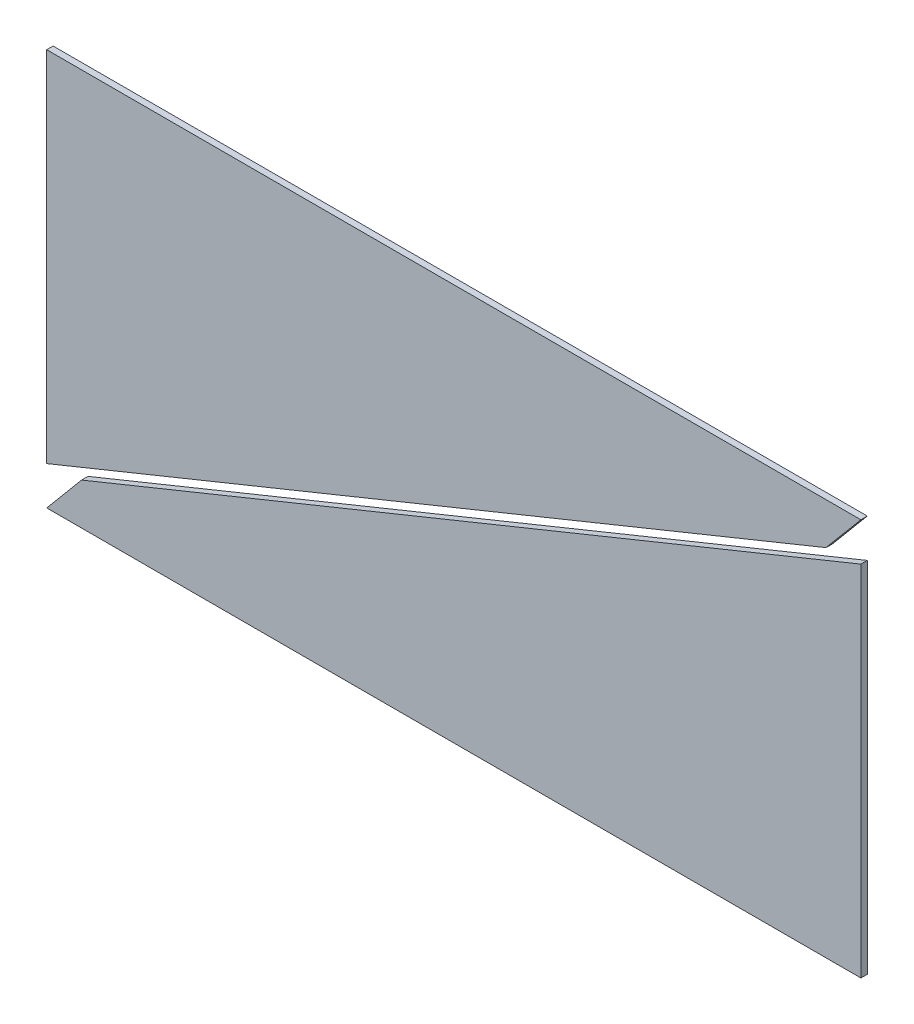
ISO-10303-21;
HEADER;
FILE_DESCRIPTION(('STEP AP214'),'2;1');
FILE_NAME('part.step','',(''),(''),'','','');
FILE_SCHEMA(('AUTOMOTIVE_DESIGN { 1 0 10303 214 1 1 1 1 }'));
ENDSEC;
DATA;
#1=APPLICATION_CONTEXT('core data for automotive mechanical design processes');
#2=APPLICATION_PROTOCOL_DEFINITION('international standard','automotive_design',2000,#1);
#3=PRODUCT_CONTEXT('',#1,'mechanical');
#4=PRODUCT('Part','Part','',(#3));
#5=PRODUCT_RELATED_PRODUCT_CATEGORY('part','',(#4));
#6=PRODUCT_DEFINITION_FORMATION('','',#4);
#7=PRODUCT_DEFINITION_CONTEXT('part definition',#1,'design');
#8=PRODUCT_DEFINITION('design','',#6,#7);
#9=PRODUCT_DEFINITION_SHAPE('','',#8);
#10=(LENGTH_UNIT() NAMED_UNIT(*) SI_UNIT(.MILLI.,.METRE.));
#11=(NAMED_UNIT(*) PLANE_ANGLE_UNIT() SI_UNIT($,.RADIAN.));
#12=(NAMED_UNIT(*) SI_UNIT($,.STERADIAN.) SOLID_ANGLE_UNIT());
#13=UNCERTAINTY_MEASURE_WITH_UNIT(LENGTH_MEASURE(1.E-05),#10,'distance_accuracy_value','');
#14=(GEOMETRIC_REPRESENTATION_CONTEXT(3) GLOBAL_UNCERTAINTY_ASSIGNED_CONTEXT((#13)) GLOBAL_UNIT_ASSIGNED_CONTEXT((#10,
#11,#12)) REPRESENTATION_CONTEXT('',''));
#15=CARTESIAN_POINT('',(0.,0.,0.));
#16=DIRECTION('',(0.,0.,1.));
#17=DIRECTION('',(1.,0.,0.));
#18=AXIS2_PLACEMENT_3D('',#15,#16,#17);
#19=CARTESIAN_POINT('',(14.5364415669839,6.12497433874092,0.25));
#20=DIRECTION('',(-0.376642714431054,0.926358605328416,0.));
#21=DIRECTION('',(-0.926358605328416,-0.376642714431054,0.));
#22=AXIS2_PLACEMENT_3D('',#19,#20,#21);
#23=PLANE('',#22);
#24=DIRECTION('',(0.926358605328416,0.376642714431054,0.));
#25=VECTOR('',#24,1.);
#26=CARTESIAN_POINT('',(14.5364415669839,6.12497433874092,0.));
#27=LINE('',#26,#25);
#28=CARTESIAN_POINT('',(-15.9,-6.25,0.));
#29=VERTEX_POINT('',#28);
#30=CARTESIAN_POINT('',(14.5364415669839,6.12497433874092,0.));
#31=VERTEX_POINT('',#30);
#32=EDGE_CURVE('E112',#29,#31,#27,.T.);
#33=ORIENTED_EDGE('',*,*,#32,.T.);
#34=DIRECTION('',(0.,0.,-1.));
#35=VECTOR('',#34,1.);
#36=CARTESIAN_POINT('',(14.5364415669839,6.12497433874092,0.25));
#37=LINE('',#36,#35);
#38=CARTESIAN_POINT('',(14.5364415669839,6.12497433874092,0.25));
#39=VERTEX_POINT('',#38);
#40=EDGE_CURVE('E12',#39,#31,#37,.T.);
#41=ORIENTED_EDGE('',*,*,#40,.F.);
#42=DIRECTION('',(0.926358605328416,0.376642714431054,0.));
#43=VECTOR('',#42,1.);
#44=CARTESIAN_POINT('',(14.5364415669839,6.12497433874092,0.25));
#45=LINE('',#44,#43);
#46=CARTESIAN_POINT('',(-15.9,-6.25,0.25));
#47=VERTEX_POINT('',#46);
#48=EDGE_CURVE('E100',#47,#39,#45,.T.);
#49=ORIENTED_EDGE('',*,*,#48,.F.);
#50=DIRECTION('',(0.,0.,-1.));
#51=VECTOR('',#50,1.);
#52=CARTESIAN_POINT('',(-15.9,-6.25,0.25));
#53=LINE('',#52,#51);
#54=EDGE_CURVE('E108',#47,#29,#53,.T.);
#55=ORIENTED_EDGE('',*,*,#54,.T.);
#56=EDGE_LOOP('',(#33,#41,#49,#55));
#57=FACE_BOUND('',#56,.T.);
#58=ADVANCED_FACE('F49',(#57),#23,.F.);
#59=CARTESIAN_POINT('',(15.9,7.75,0.25));
#60=DIRECTION('',(-0.766044443118974,0.642787609686544,0.));
#61=DIRECTION('',(-0.642787609686544,-0.766044443118974,0.));
#62=AXIS2_PLACEMENT_3D('',#59,#60,#61);
#63=PLANE('',#62);
#64=DIRECTION('',(0.642787609686544,0.766044443118974,0.));
#65=VECTOR('',#64,1.);
#66=CARTESIAN_POINT('',(15.9,7.75,0.));
#67=LINE('',#66,#65);
#68=CARTESIAN_POINT('',(15.9,7.75,0.));
#69=VERTEX_POINT('',#68);
#70=EDGE_CURVE('E104',#31,#69,#67,.T.);
#71=ORIENTED_EDGE('',*,*,#70,.T.);
#72=DIRECTION('',(0.,0.,-1.));
#73=VECTOR('',#72,1.);
#74=CARTESIAN_POINT('',(15.9,7.75,0.25));
#75=LINE('',#74,#73);
#76=CARTESIAN_POINT('',(15.9,7.75,0.25));
#77=VERTEX_POINT('',#76);
#78=EDGE_CURVE('E57',#77,#69,#75,.T.);
#79=ORIENTED_EDGE('',*,*,#78,.F.);
#80=DIRECTION('',(0.642787609686544,0.766044443118974,0.));
#81=VECTOR('',#80,1.);
#82=CARTESIAN_POINT('',(15.9,7.75,0.25));
#83=LINE('',#82,#81);
#84=EDGE_CURVE('E95',#39,#77,#83,.T.);
#85=ORIENTED_EDGE('',*,*,#84,.F.);
#86=ORIENTED_EDGE('',*,*,#40,.T.);
#87=EDGE_LOOP('',(#71,#79,#85,#86));
#88=FACE_BOUND('',#87,.T.);
#89=ADVANCED_FACE('F103',(#88),#63,.F.);
#90=CARTESIAN_POINT('',(-15.9,7.75,0.25));
#91=DIRECTION('',(0.,-1.,0.));
#92=DIRECTION('',(0.,0.,-1.));
#93=AXIS2_PLACEMENT_3D('',#90,#91,#92);
#94=PLANE('',#93);
#95=DIRECTION('',(-1.,0.,0.));
#96=VECTOR('',#95,1.);
#97=CARTESIAN_POINT('',(-15.9,7.75,0.));
#98=LINE('',#97,#96);
#99=CARTESIAN_POINT('',(-15.9,7.75,0.));
#100=VERTEX_POINT('',#99);
#101=EDGE_CURVE('E82',#69,#100,#98,.T.);
#102=ORIENTED_EDGE('',*,*,#101,.T.);
#103=DIRECTION('',(0.,0.,-1.));
#104=VECTOR('',#103,1.);
#105=CARTESIAN_POINT('',(-15.9,7.75,0.25));
#106=LINE('',#105,#104);
#107=CARTESIAN_POINT('',(-15.9,7.75,0.25));
#108=VERTEX_POINT('',#107);
#109=EDGE_CURVE('E105',#108,#100,#106,.T.);
#110=ORIENTED_EDGE('',*,*,#109,.F.);
#111=DIRECTION('',(-1.,0.,0.));
#112=VECTOR('',#111,1.);
#113=CARTESIAN_POINT('',(-15.9,7.75,0.25));
#114=LINE('',#113,#112);
#115=EDGE_CURVE('E98',#77,#108,#114,.T.);
#116=ORIENTED_EDGE('',*,*,#115,.F.);
#117=ORIENTED_EDGE('',*,*,#78,.T.);
#118=EDGE_LOOP('',(#102,#110,#116,#117));
#119=FACE_BOUND('',#118,.T.);
#120=ADVANCED_FACE('F106',(#119),#94,.F.);
#121=CARTESIAN_POINT('',(-15.9,-6.25,0.25));
#122=DIRECTION('',(1.,0.,0.));
#123=DIRECTION('',(0.,0.,-1.));
#124=AXIS2_PLACEMENT_3D('',#121,#122,#123);
#125=PLANE('',#124);
#126=DIRECTION('',(0.,-1.,0.));
#127=VECTOR('',#126,1.);
#128=CARTESIAN_POINT('',(-15.9,-6.25,0.));
#129=LINE('',#128,#127);
#130=EDGE_CURVE('E88',#100,#29,#129,.T.);
#131=ORIENTED_EDGE('',*,*,#130,.T.);
#132=ORIENTED_EDGE('',*,*,#54,.F.);
#133=DIRECTION('',(0.,-1.,0.));
#134=VECTOR('',#133,1.);
#135=CARTESIAN_POINT('',(-15.9,-6.25,0.25));
#136=LINE('',#135,#134);
#137=EDGE_CURVE('E65',#108,#47,#136,.T.);
#138=ORIENTED_EDGE('',*,*,#137,.F.);
#139=ORIENTED_EDGE('',*,*,#109,.T.);
#140=EDGE_LOOP('',(#131,#132,#138,#139));
#141=FACE_BOUND('',#140,.T.);
#142=ADVANCED_FACE('F119',(#141),#125,.F.);
#143=CARTESIAN_POINT('',(0.,0.,0.25));
#144=DIRECTION('',(0.,0.,-1.));
#145=DIRECTION('',(-1.,0.,0.));
#146=AXIS2_PLACEMENT_3D('',#143,#144,#145);
#147=PLANE('',#146);
#148=ORIENTED_EDGE('',*,*,#48,.T.);
#149=ORIENTED_EDGE('',*,*,#84,.T.);
#150=ORIENTED_EDGE('',*,*,#115,.T.);
#151=ORIENTED_EDGE('',*,*,#137,.T.);
#152=EDGE_LOOP('',(#148,#149,#150,#151));
#153=FACE_BOUND('',#152,.T.);
#154=ADVANCED_FACE('F96',(#153),#147,.F.);
#155=CARTESIAN_POINT('',(0.,0.,0.));
#156=DIRECTION('',(0.,0.,-1.));
#157=DIRECTION('',(-1.,0.,0.));
#158=AXIS2_PLACEMENT_3D('',#155,#156,#157);
#159=PLANE('',#158);
#160=ORIENTED_EDGE('',*,*,#32,.F.);
#161=ORIENTED_EDGE('',*,*,#130,.F.);
#162=ORIENTED_EDGE('',*,*,#101,.F.);
#163=ORIENTED_EDGE('',*,*,#70,.F.);
#164=EDGE_LOOP('',(#160,#161,#162,#163));
#165=FACE_BOUND('',#164,.T.);
#166=ADVANCED_FACE('F122',(#165),#159,.T.);
#167=CLOSED_SHELL('',(#58,#89,#120,#142,#154,#166));
#168=MANIFOLD_SOLID_BREP('B2',#167);
#169=CARTESIAN_POINT('',(-15.9,-7.75,0.25));
#170=DIRECTION('',(0.766044443118979,-0.642787609686539,0.));
#171=DIRECTION('',(0.642787609686539,0.766044443118979,0.));
#172=AXIS2_PLACEMENT_3D('',#169,#170,#171);
#173=PLANE('',#172);
#174=DIRECTION('',(-0.642787609686538,-0.766044443118979,0.));
#175=VECTOR('',#174,1.);
#176=CARTESIAN_POINT('',(-15.9,-7.75,0.));
#177=LINE('',#176,#175);
#178=CARTESIAN_POINT('',(-14.5364415669839,-6.1249743387409,0.));
#179=VERTEX_POINT('',#178);
#180=CARTESIAN_POINT('',(-15.9,-7.75,0.));
#181=VERTEX_POINT('',#180);
#182=EDGE_CURVE('E241',#179,#181,#177,.T.);
#183=ORIENTED_EDGE('',*,*,#182,.T.);
#184=DIRECTION('',(0.,0.,-1.));
#185=VECTOR('',#184,1.);
#186=CARTESIAN_POINT('',(-15.9,-7.75,0.25));
#187=LINE('',#186,#185);
#188=CARTESIAN_POINT('',(-15.9,-7.75,0.25));
#189=VERTEX_POINT('',#188);
#190=EDGE_CURVE('E47',#189,#181,#187,.T.);
#191=ORIENTED_EDGE('',*,*,#190,.F.);
#192=DIRECTION('',(-0.642787609686538,-0.766044443118979,0.));
#193=VECTOR('',#192,1.);
#194=CARTESIAN_POINT('',(-15.9,-7.75,0.25));
#195=LINE('',#194,#193);
#196=CARTESIAN_POINT('',(-14.5364415669839,-6.1249743387409,0.25));
#197=VERTEX_POINT('',#196);
#198=EDGE_CURVE('E225',#197,#189,#195,.T.);
#199=ORIENTED_EDGE('',*,*,#198,.F.);
#200=DIRECTION('',(0.,0.,-1.));
#201=VECTOR('',#200,1.);
#202=CARTESIAN_POINT('',(-14.5364415669839,-6.1249743387409,0.25));
#203=LINE('',#202,#201);
#204=EDGE_CURVE('E237',#197,#179,#203,.T.);
#205=ORIENTED_EDGE('',*,*,#204,.T.);
#206=EDGE_LOOP('',(#183,#191,#199,#205));
#207=FACE_BOUND('',#206,.T.);
#208=ADVANCED_FACE('F173',(#207),#173,.F.);
#209=CARTESIAN_POINT('',(-15.9,-7.75,0.25));
#210=DIRECTION('',(0.,1.,0.));
#211=DIRECTION('',(0.,0.,1.));
#212=AXIS2_PLACEMENT_3D('',#209,#210,#211);
#213=PLANE('',#212);
#214=DIRECTION('',(1.,0.,0.));
#215=VECTOR('',#214,1.);
#216=CARTESIAN_POINT('',(-15.9,-7.75,0.));
#217=LINE('',#216,#215);
#218=CARTESIAN_POINT('',(15.9,-7.75,0.));
#219=VERTEX_POINT('',#218);
#220=EDGE_CURVE('E230',#181,#219,#217,.T.);
#221=ORIENTED_EDGE('',*,*,#220,.T.);
#222=DIRECTION('',(0.,0.,-1.));
#223=VECTOR('',#222,1.);
#224=CARTESIAN_POINT('',(15.9,-7.75,0.25));
#225=LINE('',#224,#223);
#226=CARTESIAN_POINT('',(15.9,-7.75,0.25));
#227=VERTEX_POINT('',#226);
#228=EDGE_CURVE('E182',#227,#219,#225,.T.);
#229=ORIENTED_EDGE('',*,*,#228,.F.);
#230=DIRECTION('',(1.,0.,0.));
#231=VECTOR('',#230,1.);
#232=CARTESIAN_POINT('',(-15.9,-7.75,0.25));
#233=LINE('',#232,#231);
#234=EDGE_CURVE('E220',#189,#227,#233,.T.);
#235=ORIENTED_EDGE('',*,*,#234,.F.);
#236=ORIENTED_EDGE('',*,*,#190,.T.);
#237=EDGE_LOOP('',(#221,#229,#235,#236));
#238=FACE_BOUND('',#237,.T.);
#239=ADVANCED_FACE('F229',(#238),#213,.F.);
#240=CARTESIAN_POINT('',(15.9,-7.75,0.25));
#241=DIRECTION('',(-1.,0.,0.));
#242=DIRECTION('',(0.,0.,1.));
#243=AXIS2_PLACEMENT_3D('',#240,#241,#242);
#244=PLANE('',#243);
#245=DIRECTION('',(0.,1.,0.));
#246=VECTOR('',#245,1.);
#247=CARTESIAN_POINT('',(15.9,-7.75,0.));
#248=LINE('',#247,#246);
#249=CARTESIAN_POINT('',(15.9,6.25,0.));
#250=VERTEX_POINT('',#249);
#251=EDGE_CURVE('E207',#219,#250,#248,.T.);
#252=ORIENTED_EDGE('',*,*,#251,.T.);
#253=DIRECTION('',(0.,0.,-1.));
#254=VECTOR('',#253,1.);
#255=CARTESIAN_POINT('',(15.9,6.25,0.25));
#256=LINE('',#255,#254);
#257=CARTESIAN_POINT('',(15.9,6.25,0.25));
#258=VERTEX_POINT('',#257);
#259=EDGE_CURVE('E232',#258,#250,#256,.T.);
#260=ORIENTED_EDGE('',*,*,#259,.F.);
#261=DIRECTION('',(0.,1.,0.));
#262=VECTOR('',#261,1.);
#263=CARTESIAN_POINT('',(15.9,-7.75,0.25));
#264=LINE('',#263,#262);
#265=EDGE_CURVE('E223',#227,#258,#264,.T.);
#266=ORIENTED_EDGE('',*,*,#265,.F.);
#267=ORIENTED_EDGE('',*,*,#228,.T.);
#268=EDGE_LOOP('',(#252,#260,#266,#267));
#269=FACE_BOUND('',#268,.T.);
#270=ADVANCED_FACE('F233',(#269),#244,.F.);
#271=CARTESIAN_POINT('',(-14.5364415669839,-6.1249743387409,0.25));
#272=DIRECTION('',(0.376642714431054,-0.926358605328416,0.));
#273=DIRECTION('',(0.926358605328416,0.376642714431054,0.));
#274=AXIS2_PLACEMENT_3D('',#271,#272,#273);
#275=PLANE('',#274);
#276=DIRECTION('',(-0.926358605328416,-0.376642714431054,0.));
#277=VECTOR('',#276,1.);
#278=CARTESIAN_POINT('',(-14.5364415669839,-6.1249743387409,0.));
#279=LINE('',#278,#277);
#280=EDGE_CURVE('E213',#250,#179,#279,.T.);
#281=ORIENTED_EDGE('',*,*,#280,.T.);
#282=ORIENTED_EDGE('',*,*,#204,.F.);
#283=DIRECTION('',(-0.926358605328416,-0.376642714431054,0.));
#284=VECTOR('',#283,1.);
#285=CARTESIAN_POINT('',(-14.5364415669839,-6.1249743387409,0.25));
#286=LINE('',#285,#284);
#287=EDGE_CURVE('E190',#258,#197,#286,.T.);
#288=ORIENTED_EDGE('',*,*,#287,.F.);
#289=ORIENTED_EDGE('',*,*,#259,.T.);
#290=EDGE_LOOP('',(#281,#282,#288,#289));
#291=FACE_BOUND('',#290,.T.);
#292=ADVANCED_FACE('F254',(#291),#275,.F.);
#293=CARTESIAN_POINT('',(0.,0.,0.25));
#294=DIRECTION('',(0.,0.,-1.));
#295=DIRECTION('',(-1.,0.,0.));
#296=AXIS2_PLACEMENT_3D('',#293,#294,#295);
#297=PLANE('',#296);
#298=ORIENTED_EDGE('',*,*,#198,.T.);
#299=ORIENTED_EDGE('',*,*,#234,.T.);
#300=ORIENTED_EDGE('',*,*,#265,.T.);
#301=ORIENTED_EDGE('',*,*,#287,.T.);
#302=EDGE_LOOP('',(#298,#299,#300,#301));
#303=FACE_BOUND('',#302,.T.);
#304=ADVANCED_FACE('F221',(#303),#297,.F.);
#305=CARTESIAN_POINT('',(0.,0.,0.));
#306=DIRECTION('',(0.,0.,-1.));
#307=DIRECTION('',(-1.,0.,0.));
#308=AXIS2_PLACEMENT_3D('',#305,#306,#307);
#309=PLANE('',#308);
#310=ORIENTED_EDGE('',*,*,#182,.F.);
#311=ORIENTED_EDGE('',*,*,#280,.F.);
#312=ORIENTED_EDGE('',*,*,#251,.F.);
#313=ORIENTED_EDGE('',*,*,#220,.F.);
#314=EDGE_LOOP('',(#310,#311,#312,#313));
#315=FACE_BOUND('',#314,.T.);
#316=ADVANCED_FACE('F257',(#315),#309,.T.);
#317=CLOSED_SHELL('',(#208,#239,#270,#292,#304,#316));
#318=MANIFOLD_SOLID_BREP('B6',#317);
#319=ADVANCED_BREP_SHAPE_REPRESENTATION('',(#18,#168,#318),#14);
#320=SHAPE_DEFINITION_REPRESENTATION(#9,#319);
ENDSEC;
END-ISO-10303-21;
